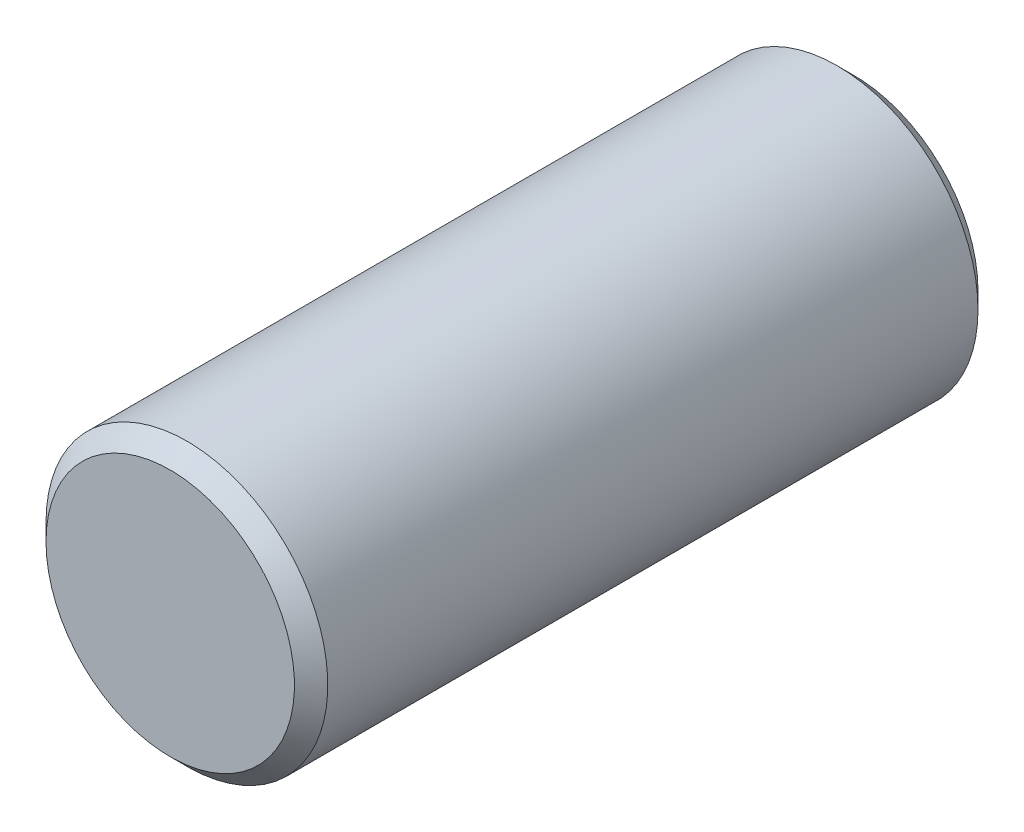
ISO-10303-21;
HEADER;
FILE_DESCRIPTION(('STEP AP214'),'2;1');
FILE_NAME('part.step','',(''),(''),'','','');
FILE_SCHEMA(('AUTOMOTIVE_DESIGN { 1 0 10303 214 1 1 1 1 }'));
ENDSEC;
DATA;
#1=APPLICATION_CONTEXT('core data for automotive mechanical design processes');
#2=APPLICATION_PROTOCOL_DEFINITION('international standard','automotive_design',2000,#1);
#3=PRODUCT_CONTEXT('',#1,'mechanical');
#4=PRODUCT('Part','Part','',(#3));
#5=PRODUCT_RELATED_PRODUCT_CATEGORY('part','',(#4));
#6=PRODUCT_DEFINITION_FORMATION('','',#4);
#7=PRODUCT_DEFINITION_CONTEXT('part definition',#1,'design');
#8=PRODUCT_DEFINITION('design','',#6,#7);
#9=PRODUCT_DEFINITION_SHAPE('','',#8);
#10=(LENGTH_UNIT() NAMED_UNIT(*) SI_UNIT(.MILLI.,.METRE.));
#11=(NAMED_UNIT(*) PLANE_ANGLE_UNIT() SI_UNIT($,.RADIAN.));
#12=(NAMED_UNIT(*) SI_UNIT($,.STERADIAN.) SOLID_ANGLE_UNIT());
#13=UNCERTAINTY_MEASURE_WITH_UNIT(LENGTH_MEASURE(1.E-05),#10,'distance_accuracy_value','');
#14=(GEOMETRIC_REPRESENTATION_CONTEXT(3) GLOBAL_UNCERTAINTY_ASSIGNED_CONTEXT((#13)) GLOBAL_UNIT_ASSIGNED_CONTEXT((#10,
#11,#12)) REPRESENTATION_CONTEXT('',''));
#15=CARTESIAN_POINT('',(0.,0.,0.));
#16=DIRECTION('',(0.,0.,1.));
#17=DIRECTION('',(1.,0.,0.));
#18=AXIS2_PLACEMENT_3D('',#15,#16,#17);
#19=CARTESIAN_POINT('',(0.,0.,1041.4));
#20=DIRECTION('',(0.,0.,-1.));
#21=DIRECTION('',(-1.,0.,0.));
#22=AXIS2_PLACEMENT_3D('',#19,#20,#21);
#23=CYLINDRICAL_SURFACE('',#22,429.26);
#24=CARTESIAN_POINT('',(0.,0.,-990.6));
#25=DIRECTION('',(0.,0.,1.));
#26=DIRECTION('',(1.,0.,0.));
#27=AXIS2_PLACEMENT_3D('',#24,#25,#26);
#28=CIRCLE('',#27,429.26);
#29=CARTESIAN_POINT('',(-429.26,0.,-990.6));
#30=VERTEX_POINT('',#29);
#31=EDGE_CURVE('E51',#30,#30,#28,.T.);
#32=CARTESIAN_POINT('',(0.,0.,990.6));
#33=DIRECTION('',(0.,0.,1.));
#34=DIRECTION('',(1.,0.,0.));
#35=AXIS2_PLACEMENT_3D('',#32,#33,#34);
#36=CIRCLE('',#35,429.26);
#37=CARTESIAN_POINT('',(-429.26,0.,990.6));
#38=VERTEX_POINT('',#37);
#39=EDGE_CURVE('E54',#38,#38,#36,.F.);
#40=CARTESIAN_POINT('',(-429.26,0.,-990.6));
#41=CARTESIAN_POINT('',(-429.26,0.,-969.9625));
#42=CARTESIAN_POINT('',(-429.26,0.,-949.325));
#43=CARTESIAN_POINT('',(-429.26,0.,-908.05));
#44=CARTESIAN_POINT('',(-429.26,0.,-887.4125));
#45=CARTESIAN_POINT('',(-429.26,0.,-846.1375));
#46=CARTESIAN_POINT('',(-429.26,0.,-825.5));
#47=CARTESIAN_POINT('',(-429.26,0.,-784.225));
#48=CARTESIAN_POINT('',(-429.26,0.,-763.5875));
#49=CARTESIAN_POINT('',(-429.26,0.,-722.3125));
#50=CARTESIAN_POINT('',(-429.26,0.,-701.675));
#51=CARTESIAN_POINT('',(-429.26,0.,-660.4));
#52=CARTESIAN_POINT('',(-429.26,0.,-639.7625));
#53=CARTESIAN_POINT('',(-429.26,0.,-598.4875));
#54=CARTESIAN_POINT('',(-429.26,0.,-577.85));
#55=CARTESIAN_POINT('',(-429.26,0.,-536.575));
#56=CARTESIAN_POINT('',(-429.26,0.,-515.9375));
#57=CARTESIAN_POINT('',(-429.26,0.,-474.6625));
#58=CARTESIAN_POINT('',(-429.26,0.,-454.025));
#59=CARTESIAN_POINT('',(-429.26,0.,-412.75));
#60=CARTESIAN_POINT('',(-429.26,0.,-392.1125));
#61=CARTESIAN_POINT('',(-429.26,0.,-350.8375));
#62=CARTESIAN_POINT('',(-429.26,0.,-330.2));
#63=CARTESIAN_POINT('',(-429.26,0.,-288.925));
#64=CARTESIAN_POINT('',(-429.26,0.,-268.2875));
#65=CARTESIAN_POINT('',(-429.26,0.,-227.0125));
#66=CARTESIAN_POINT('',(-429.26,0.,-206.375));
#67=CARTESIAN_POINT('',(-429.26,0.,-165.1));
#68=CARTESIAN_POINT('',(-429.26,0.,-144.4625));
#69=CARTESIAN_POINT('',(-429.26,0.,-103.1875));
#70=CARTESIAN_POINT('',(-429.26,0.,-82.5500000000002));
#71=CARTESIAN_POINT('',(-429.26,0.,-41.2750000000002));
#72=CARTESIAN_POINT('',(-429.26,0.,-20.6375000000002));
#73=CARTESIAN_POINT('',(-429.26,0.,20.6374999999998));
#74=CARTESIAN_POINT('',(-429.26,0.,41.2749999999998));
#75=CARTESIAN_POINT('',(-429.26,0.,82.5499999999998));
#76=CARTESIAN_POINT('',(-429.26,0.,103.1875));
#77=CARTESIAN_POINT('',(-429.26,0.,144.4625));
#78=CARTESIAN_POINT('',(-429.26,0.,165.1));
#79=CARTESIAN_POINT('',(-429.26,0.,206.375));
#80=CARTESIAN_POINT('',(-429.26,0.,227.0125));
#81=CARTESIAN_POINT('',(-429.26,0.,268.2875));
#82=CARTESIAN_POINT('',(-429.26,0.,288.925));
#83=CARTESIAN_POINT('',(-429.26,0.,330.2));
#84=CARTESIAN_POINT('',(-429.26,0.,350.8375));
#85=CARTESIAN_POINT('',(-429.26,0.,392.1125));
#86=CARTESIAN_POINT('',(-429.26,0.,412.75));
#87=CARTESIAN_POINT('',(-429.26,0.,454.025));
#88=CARTESIAN_POINT('',(-429.26,0.,474.6625));
#89=CARTESIAN_POINT('',(-429.26,0.,515.9375));
#90=CARTESIAN_POINT('',(-429.26,0.,536.575));
#91=CARTESIAN_POINT('',(-429.26,0.,577.85));
#92=CARTESIAN_POINT('',(-429.26,0.,598.4875));
#93=CARTESIAN_POINT('',(-429.26,0.,639.7625));
#94=CARTESIAN_POINT('',(-429.26,0.,660.4));
#95=CARTESIAN_POINT('',(-429.26,0.,701.675));
#96=CARTESIAN_POINT('',(-429.26,0.,722.3125));
#97=CARTESIAN_POINT('',(-429.26,0.,763.5875));
#98=CARTESIAN_POINT('',(-429.26,0.,784.225));
#99=CARTESIAN_POINT('',(-429.26,0.,825.5));
#100=CARTESIAN_POINT('',(-429.26,0.,846.1375));
#101=CARTESIAN_POINT('',(-429.26,0.,887.4125));
#102=CARTESIAN_POINT('',(-429.26,0.,908.05));
#103=CARTESIAN_POINT('',(-429.26,0.,949.325));
#104=CARTESIAN_POINT('',(-429.26,0.,969.9625));
#105=CARTESIAN_POINT('',(-429.26,0.,990.6));
#106=B_SPLINE_CURVE_WITH_KNOTS('',3,(#40,#41,#42,#43,#44,#45,#46,#47,#48,#49,#50,#51,#52,#53,
#54,#55,#56,#57,#58,#59,#60,#61,#62,#63,#64,#65,#66,#67,#68,#69,#70,#71,#72,#73,#74,#75,#76,#77,
#78,#79,#80,#81,#82,#83,#84,#85,#86,#87,#88,#89,#90,#91,#92,#93,#94,#95,#96,#97,#98,#99,#100,
#101,#102,#103,#104,#105),.UNSPECIFIED.,.F.,.F.,(4,2,2,2,2,2,2,2,2,2,2,2,2,2,2,2,2,2,2,2,2,2,2,
2,2,2,2,2,2,2,2,2,4),(0.,61.9125,123.825,185.7375,247.65,309.5625,371.475,433.3875,495.3,
557.2125,619.125,681.0375,742.95,804.8625,866.775,928.6875,990.6,1052.5125,1114.425,1176.3375,
1238.25,1300.1625,1362.075,1423.9875,1485.9,1547.8125,1609.725,1671.6375,1733.55,1795.4625,
1857.375,1919.2875,1981.2),.UNSPECIFIED.);
#107=EDGE_CURVE('BSEAM39',#30,#38,#106,.T.);
#108=ORIENTED_EDGE('',*,*,#31,.T.);
#109=ORIENTED_EDGE('',*,*,#39,.T.);
#110=ORIENTED_EDGE('',*,*,#107,.T.);
#111=ORIENTED_EDGE('',*,*,#107,.F.);
#112=EDGE_LOOP('',(#108,#110,#109,#111));
#113=FACE_BOUND('',#112,.T.);
#114=ADVANCED_FACE('F39',(#113),#23,.T.);
#115=CARTESIAN_POINT('',(0.,0.,1041.4));
#116=DIRECTION('',(0.,0.,1.));
#117=DIRECTION('',(1.,0.,0.));
#118=AXIS2_PLACEMENT_3D('',#115,#116,#117);
#119=PLANE('',#118);
#120=CARTESIAN_POINT('',(0.,0.,1041.4));
#121=DIRECTION('',(0.,0.,1.));
#122=DIRECTION('',(1.,0.,0.));
#123=AXIS2_PLACEMENT_3D('',#120,#121,#122);
#124=CIRCLE('',#123,378.46);
#125=CARTESIAN_POINT('',(-378.46,0.,1041.4));
#126=VERTEX_POINT('',#125);
#127=EDGE_CURVE('E10',#126,#126,#124,.T.);
#128=ORIENTED_EDGE('',*,*,#127,.T.);
#129=EDGE_LOOP('',(#128));
#130=FACE_BOUND('',#129,.T.);
#131=ADVANCED_FACE('F72',(#130),#119,.T.);
#132=CARTESIAN_POINT('',(0.,0.,-1041.4));
#133=DIRECTION('',(0.,0.,1.));
#134=DIRECTION('',(1.,0.,0.));
#135=AXIS2_PLACEMENT_3D('',#132,#133,#134);
#136=PLANE('',#135);
#137=CARTESIAN_POINT('',(0.,0.,-1041.4));
#138=DIRECTION('',(0.,0.,1.));
#139=DIRECTION('',(1.,0.,0.));
#140=AXIS2_PLACEMENT_3D('',#137,#138,#139);
#141=CIRCLE('',#140,378.46);
#142=CARTESIAN_POINT('',(378.46,0.,-1041.4));
#143=VERTEX_POINT('',#142);
#144=EDGE_CURVE('E50',#143,#143,#141,.F.);
#145=ORIENTED_EDGE('',*,*,#144,.T.);
#146=EDGE_LOOP('',(#145));
#147=FACE_BOUND('',#146,.T.);
#148=ADVANCED_FACE('F67',(#147),#136,.F.);
#149=CARTESIAN_POINT('',(0.,0.,-990.6));
#150=DIRECTION('',(0.,0.,1.));
#151=DIRECTION('',(1.,0.,0.));
#152=AXIS2_PLACEMENT_3D('',#149,#150,#151);
#153=CONICAL_SURFACE('',#152,429.26,0.785398163397448);
#154=ORIENTED_EDGE('',*,*,#144,.F.);
#155=EDGE_LOOP('',(#154));
#156=FACE_BOUND('',#155,.T.);
#157=ORIENTED_EDGE('',*,*,#31,.F.);
#158=EDGE_LOOP('',(#157));
#159=FACE_BOUND('',#158,.T.);
#160=ADVANCED_FACE('F61',(#156,#159),#153,.T.);
#161=CARTESIAN_POINT('',(0.,0.,1041.4));
#162=DIRECTION('',(0.,0.,-1.));
#163=DIRECTION('',(-1.,0.,0.));
#164=AXIS2_PLACEMENT_3D('',#161,#162,#163);
#165=CONICAL_SURFACE('',#164,378.46,0.785398163397444);
#166=CARTESIAN_POINT('',(-429.26,0.,990.6));
#167=CARTESIAN_POINT('',(-428.730833333333,0.,991.129166666666));
#168=CARTESIAN_POINT('',(-428.201666666667,0.,991.658333333333));
#169=CARTESIAN_POINT('',(-427.143333333333,0.,992.716666666666));
#170=CARTESIAN_POINT('',(-426.614166666667,0.,993.245833333333));
#171=CARTESIAN_POINT('',(-425.555833333333,0.,994.304166666666));
#172=CARTESIAN_POINT('',(-425.026666666667,0.,994.833333333333));
#173=CARTESIAN_POINT('',(-423.968333333333,0.,995.891666666666));
#174=CARTESIAN_POINT('',(-423.439166666667,0.,996.420833333333));
#175=CARTESIAN_POINT('',(-422.380833333333,0.,997.479166666666));
#176=CARTESIAN_POINT('',(-421.851666666667,0.,998.008333333333));
#177=CARTESIAN_POINT('',(-420.793333333333,0.,999.066666666666));
#178=CARTESIAN_POINT('',(-420.264166666667,0.,999.595833333333));
#179=CARTESIAN_POINT('',(-419.205833333333,0.,1000.65416666667));
#180=CARTESIAN_POINT('',(-418.676666666667,0.,1001.18333333333));
#181=CARTESIAN_POINT('',(-417.618333333333,0.,1002.24166666667));
#182=CARTESIAN_POINT('',(-417.089166666667,0.,1002.77083333333));
#183=CARTESIAN_POINT('',(-416.030833333333,0.,1003.82916666667));
#184=CARTESIAN_POINT('',(-415.501666666667,0.,1004.35833333333));
#185=CARTESIAN_POINT('',(-414.443333333333,0.,1005.41666666667));
#186=CARTESIAN_POINT('',(-413.914166666667,0.,1005.94583333333));
#187=CARTESIAN_POINT('',(-412.855833333333,0.,1007.00416666667));
#188=CARTESIAN_POINT('',(-412.326666666667,0.,1007.53333333333));
#189=CARTESIAN_POINT('',(-411.268333333333,0.,1008.59166666667));
#190=CARTESIAN_POINT('',(-410.739166666667,0.,1009.12083333333));
#191=CARTESIAN_POINT('',(-409.680833333334,0.,1010.17916666667));
#192=CARTESIAN_POINT('',(-409.151666666667,0.,1010.70833333333));
#193=CARTESIAN_POINT('',(-408.093333333334,0.,1011.76666666667));
#194=CARTESIAN_POINT('',(-407.564166666667,0.,1012.29583333333));
#195=CARTESIAN_POINT('',(-406.505833333333,0.,1013.35416666667));
#196=CARTESIAN_POINT('',(-405.976666666667,0.,1013.88333333333));
#197=CARTESIAN_POINT('',(-404.918333333334,0.,1014.94166666667));
#198=CARTESIAN_POINT('',(-404.389166666667,0.,1015.47083333333));
#199=CARTESIAN_POINT('',(-403.330833333334,0.,1016.52916666667));
#200=CARTESIAN_POINT('',(-402.801666666667,0.,1017.05833333333));
#201=CARTESIAN_POINT('',(-401.743333333334,0.,1018.11666666667));
#202=CARTESIAN_POINT('',(-401.214166666667,0.,1018.64583333333));
#203=CARTESIAN_POINT('',(-400.155833333334,0.,1019.70416666667));
#204=CARTESIAN_POINT('',(-399.626666666667,0.,1020.23333333333));
#205=CARTESIAN_POINT('',(-398.568333333334,0.,1021.29166666667));
#206=CARTESIAN_POINT('',(-398.039166666667,0.,1021.82083333333));
#207=CARTESIAN_POINT('',(-396.980833333334,0.,1022.87916666667));
#208=CARTESIAN_POINT('',(-396.451666666667,0.,1023.40833333333));
#209=CARTESIAN_POINT('',(-395.393333333334,0.,1024.46666666667));
#210=CARTESIAN_POINT('',(-394.864166666667,0.,1024.99583333333));
#211=CARTESIAN_POINT('',(-393.805833333334,0.,1026.05416666667));
#212=CARTESIAN_POINT('',(-393.276666666667,0.,1026.58333333333));
#213=CARTESIAN_POINT('',(-392.218333333334,0.,1027.64166666667));
#214=CARTESIAN_POINT('',(-391.689166666667,0.,1028.17083333333));
#215=CARTESIAN_POINT('',(-390.630833333334,0.,1029.22916666667));
#216=CARTESIAN_POINT('',(-390.101666666667,0.,1029.75833333333));
#217=CARTESIAN_POINT('',(-389.043333333334,0.,1030.81666666667));
#218=CARTESIAN_POINT('',(-388.514166666667,0.,1031.34583333333));
#219=CARTESIAN_POINT('',(-387.455833333334,0.,1032.40416666667));
#220=CARTESIAN_POINT('',(-386.926666666667,0.,1032.93333333333));
#221=CARTESIAN_POINT('',(-385.868333333334,0.,1033.99166666667));
#222=CARTESIAN_POINT('',(-385.339166666667,0.,1034.52083333333));
#223=CARTESIAN_POINT('',(-384.280833333334,0.,1035.57916666667));
#224=CARTESIAN_POINT('',(-383.751666666667,0.,1036.10833333333));
#225=CARTESIAN_POINT('',(-382.693333333334,0.,1037.16666666667));
#226=CARTESIAN_POINT('',(-382.164166666667,0.,1037.69583333333));
#227=CARTESIAN_POINT('',(-381.105833333334,0.,1038.75416666667));
#228=CARTESIAN_POINT('',(-380.576666666667,0.,1039.28333333333));
#229=CARTESIAN_POINT('',(-379.518333333334,0.,1040.34166666667));
#230=CARTESIAN_POINT('',(-378.989166666667,0.,1040.87083333333));
#231=CARTESIAN_POINT('',(-378.46,0.,1041.4));
#232=B_SPLINE_CURVE_WITH_KNOTS('',3,(#166,#167,#168,#169,#170,#171,#172,#173,#174,#175,#176,
#177,#178,#179,#180,#181,#182,#183,#184,#185,#186,#187,#188,#189,#190,#191,#192,#193,#194,#195,
#196,#197,#198,#199,#200,#201,#202,#203,#204,#205,#206,#207,#208,#209,#210,#211,#212,#213,#214,
#215,#216,#217,#218,#219,#220,#221,#222,#223,#224,#225,#226,#227,#228,#229,#230,#231),
.UNSPECIFIED.,.F.,.F.,(4,2,2,2,2,2,2,2,2,2,2,2,2,2,2,2,2,2,2,2,2,2,2,2,2,2,2,2,2,2,2,2,4),(0.,
2.24506403026732,4.49012806053459,6.73519209080191,8.98025612106919,11.2253201513364,
13.4703841816038,15.7154482118709,17.9605122421383,20.2055762724056,22.450640302673,
24.6957043329401,26.9407683632074,29.1858323934748,31.430896423742,33.6759604540093,
35.9210244842766,38.1660885145438,40.4111525448111,42.6562165750785,44.9012806053456,
47.146344635613,49.3914086658803,51.6364726961475,53.8815367264148,56.1266007566822,
58.3716647869494,60.6167288172167,62.861792847484,65.1068568777512,67.3519209080185,
69.5969849382859,71.8420489685532),.UNSPECIFIED.);
#233=EDGE_CURVE('BSEAM45',#38,#126,#232,.T.);
#234=ORIENTED_EDGE('',*,*,#39,.F.);
#235=ORIENTED_EDGE('',*,*,#127,.F.);
#236=ORIENTED_EDGE('',*,*,#233,.T.);
#237=ORIENTED_EDGE('',*,*,#233,.F.);
#238=EDGE_LOOP('',(#234,#236,#235,#237));
#239=FACE_BOUND('',#238,.T.);
#240=ADVANCED_FACE('F45',(#239),#165,.T.);
#241=CLOSED_SHELL('',(#114,#131,#148,#160,#240));
#242=MANIFOLD_SOLID_BREP('B2',#241);
#243=ADVANCED_BREP_SHAPE_REPRESENTATION('',(#18,#242),#14);
#244=SHAPE_DEFINITION_REPRESENTATION(#9,#243);
ENDSEC;
END-ISO-10303-21;
